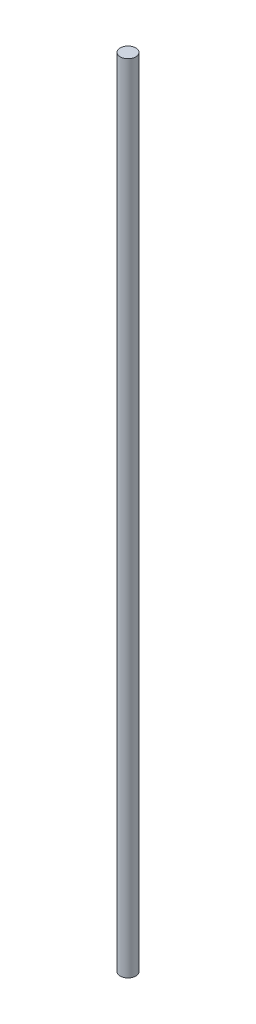
ISO-10303-21;
HEADER;
FILE_DESCRIPTION(('STEP AP214'),'2;1');
FILE_NAME('part.step','',(''),(''),'','','');
FILE_SCHEMA(('AUTOMOTIVE_DESIGN { 1 0 10303 214 1 1 1 1 }'));
ENDSEC;
DATA;
#1=APPLICATION_CONTEXT('core data for automotive mechanical design processes');
#2=APPLICATION_PROTOCOL_DEFINITION('international standard','automotive_design',2000,#1);
#3=PRODUCT_CONTEXT('',#1,'mechanical');
#4=PRODUCT('Part','Part','',(#3));
#5=PRODUCT_RELATED_PRODUCT_CATEGORY('part','',(#4));
#6=PRODUCT_DEFINITION_FORMATION('','',#4);
#7=PRODUCT_DEFINITION_CONTEXT('part definition',#1,'design');
#8=PRODUCT_DEFINITION('design','',#6,#7);
#9=PRODUCT_DEFINITION_SHAPE('','',#8);
#10=(LENGTH_UNIT() NAMED_UNIT(*) SI_UNIT(.MILLI.,.METRE.));
#11=(NAMED_UNIT(*) PLANE_ANGLE_UNIT() SI_UNIT($,.RADIAN.));
#12=(NAMED_UNIT(*) SI_UNIT($,.STERADIAN.) SOLID_ANGLE_UNIT());
#13=UNCERTAINTY_MEASURE_WITH_UNIT(LENGTH_MEASURE(1.E-05),#10,'distance_accuracy_value','');
#14=(GEOMETRIC_REPRESENTATION_CONTEXT(3) GLOBAL_UNCERTAINTY_ASSIGNED_CONTEXT((#13)) GLOBAL_UNIT_ASSIGNED_CONTEXT((#10,
#11,#12)) REPRESENTATION_CONTEXT('',''));
#15=CARTESIAN_POINT('',(0.,0.,0.));
#16=DIRECTION('',(0.,0.,1.));
#17=DIRECTION('',(1.,0.,0.));
#18=AXIS2_PLACEMENT_3D('',#15,#16,#17);
#19=CARTESIAN_POINT('',(0.,307.,0.));
#20=DIRECTION('',(0.,-1.,0.));
#21=DIRECTION('',(0.,0.,-1.));
#22=AXIS2_PLACEMENT_3D('',#19,#20,#21);
#23=CYLINDRICAL_SURFACE('',#22,3.);
#24=CARTESIAN_POINT('',(0.,307.,0.));
#25=DIRECTION('',(0.,1.,0.));
#26=DIRECTION('',(0.,0.,1.));
#27=AXIS2_PLACEMENT_3D('',#24,#25,#26);
#28=CIRCLE('',#27,3.);
#29=CARTESIAN_POINT('',(0.,307.,3.));
#30=VERTEX_POINT('',#29);
#31=EDGE_CURVE('E10',#30,#30,#28,.T.);
#32=ORIENTED_EDGE('',*,*,#31,.F.);
#33=EDGE_LOOP('',(#32));
#34=FACE_BOUND('',#33,.T.);
#35=CARTESIAN_POINT('',(0.,0.,0.));
#36=DIRECTION('',(0.,1.,0.));
#37=DIRECTION('',(0.,0.,1.));
#38=AXIS2_PLACEMENT_3D('',#35,#36,#37);
#39=CIRCLE('',#38,3.);
#40=CARTESIAN_POINT('',(0.,0.,3.));
#41=VERTEX_POINT('',#40);
#42=EDGE_CURVE('E33',#41,#41,#39,.T.);
#43=ORIENTED_EDGE('',*,*,#42,.T.);
#44=EDGE_LOOP('',(#43));
#45=FACE_BOUND('',#44,.T.);
#46=ADVANCED_FACE('F30',(#34,#45),#23,.T.);
#47=CARTESIAN_POINT('',(0.,307.,0.));
#48=DIRECTION('',(0.,1.,0.));
#49=DIRECTION('',(0.,0.,1.));
#50=AXIS2_PLACEMENT_3D('',#47,#48,#49);
#51=PLANE('',#50);
#52=ORIENTED_EDGE('',*,*,#31,.T.);
#53=EDGE_LOOP('',(#52));
#54=FACE_BOUND('',#53,.T.);
#55=ADVANCED_FACE('F45',(#54),#51,.T.);
#56=CARTESIAN_POINT('',(0.,0.,0.));
#57=DIRECTION('',(0.,1.,0.));
#58=DIRECTION('',(0.,0.,1.));
#59=AXIS2_PLACEMENT_3D('',#56,#57,#58);
#60=PLANE('',#59);
#61=ORIENTED_EDGE('',*,*,#42,.F.);
#62=EDGE_LOOP('',(#61));
#63=FACE_BOUND('',#62,.T.);
#64=ADVANCED_FACE('F43',(#63),#60,.F.);
#65=CLOSED_SHELL('',(#46,#55,#64));
#66=MANIFOLD_SOLID_BREP('B2',#65);
#67=ADVANCED_BREP_SHAPE_REPRESENTATION('',(#18,#66),#14);
#68=SHAPE_DEFINITION_REPRESENTATION(#9,#67);
ENDSEC;
END-ISO-10303-21;
